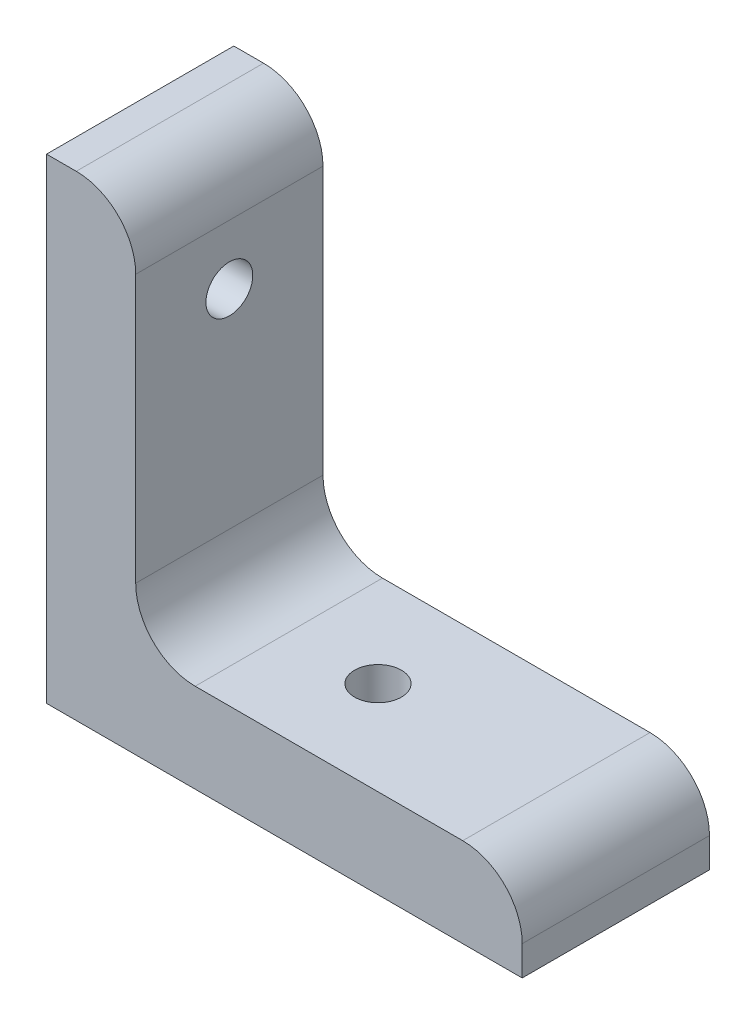
ISO-10303-21;
HEADER;
FILE_DESCRIPTION(('STEP AP214'),'2;1');
FILE_NAME('part.step','',(''),(''),'','','');
FILE_SCHEMA(('AUTOMOTIVE_DESIGN { 1 0 10303 214 1 1 1 1 }'));
ENDSEC;
DATA;
#1=APPLICATION_CONTEXT('core data for automotive mechanical design processes');
#2=APPLICATION_PROTOCOL_DEFINITION('international standard','automotive_design',2000,#1);
#3=PRODUCT_CONTEXT('',#1,'mechanical');
#4=PRODUCT('Part','Part','',(#3));
#5=PRODUCT_RELATED_PRODUCT_CATEGORY('part','',(#4));
#6=PRODUCT_DEFINITION_FORMATION('','',#4);
#7=PRODUCT_DEFINITION_CONTEXT('part definition',#1,'design');
#8=PRODUCT_DEFINITION('design','',#6,#7);
#9=PRODUCT_DEFINITION_SHAPE('','',#8);
#10=(LENGTH_UNIT() NAMED_UNIT(*) SI_UNIT(.MILLI.,.METRE.));
#11=(NAMED_UNIT(*) PLANE_ANGLE_UNIT() SI_UNIT($,.RADIAN.));
#12=(NAMED_UNIT(*) SI_UNIT($,.STERADIAN.) SOLID_ANGLE_UNIT());
#13=UNCERTAINTY_MEASURE_WITH_UNIT(LENGTH_MEASURE(1.E-05),#10,'distance_accuracy_value','');
#14=(GEOMETRIC_REPRESENTATION_CONTEXT(3) GLOBAL_UNCERTAINTY_ASSIGNED_CONTEXT((#13)) GLOBAL_UNIT_ASSIGNED_CONTEXT((#10,
#11,#12)) REPRESENTATION_CONTEXT('',''));
#15=CARTESIAN_POINT('',(0.,0.,0.));
#16=DIRECTION('',(0.,0.,1.));
#17=DIRECTION('',(1.,0.,0.));
#18=AXIS2_PLACEMENT_3D('',#15,#16,#17);
#19=CARTESIAN_POINT('',(50.8,0.,-20.));
#20=DIRECTION('',(0.,-1.,0.));
#21=DIRECTION('',(1.,0.,0.));
#22=AXIS2_PLACEMENT_3D('',#19,#20,#21);
#23=PLANE('',#22);
#24=CARTESIAN_POINT('',(25.4,0.,-10.));
#25=DIRECTION('',(0.,-1.,0.));
#26=DIRECTION('',(0.,0.,-1.));
#27=AXIS2_PLACEMENT_3D('',#24,#25,#26);
#28=CIRCLE('',#27,2.5);
#29=CARTESIAN_POINT('',(25.4,0.,-12.5));
#30=VERTEX_POINT('',#29);
#31=EDGE_CURVE('E315',#30,#30,#28,.T.);
#32=ORIENTED_EDGE('',*,*,#31,.F.);
#33=EDGE_LOOP('',(#32));
#34=FACE_BOUND('',#33,.T.);
#35=DIRECTION('',(1.,0.,0.));
#36=VECTOR('',#35,1.);
#37=CARTESIAN_POINT('',(50.8,0.,0.));
#38=LINE('',#37,#36);
#39=CARTESIAN_POINT('',(0.,0.,0.));
#40=VERTEX_POINT('',#39);
#41=CARTESIAN_POINT('',(50.8,0.,0.));
#42=VERTEX_POINT('',#41);
#43=EDGE_CURVE('E142',#40,#42,#38,.T.);
#44=ORIENTED_EDGE('',*,*,#43,.F.);
#45=DIRECTION('',(0.,0.,1.));
#46=VECTOR('',#45,1.);
#47=CARTESIAN_POINT('',(0.,0.,-20.));
#48=LINE('',#47,#46);
#49=CARTESIAN_POINT('',(0.,0.,-20.));
#50=VERTEX_POINT('',#49);
#51=EDGE_CURVE('E125',#50,#40,#48,.T.);
#52=ORIENTED_EDGE('',*,*,#51,.F.);
#53=DIRECTION('',(1.,0.,0.));
#54=VECTOR('',#53,1.);
#55=CARTESIAN_POINT('',(50.8,0.,-20.));
#56=LINE('',#55,#54);
#57=CARTESIAN_POINT('',(50.8,0.,-20.));
#58=VERTEX_POINT('',#57);
#59=EDGE_CURVE('E121',#50,#58,#56,.T.);
#60=ORIENTED_EDGE('',*,*,#59,.T.);
#61=DIRECTION('',(0.,0.,1.));
#62=VECTOR('',#61,1.);
#63=CARTESIAN_POINT('',(50.8,0.,-20.));
#64=LINE('',#63,#62);
#65=EDGE_CURVE('E103',#58,#42,#64,.T.);
#66=ORIENTED_EDGE('',*,*,#65,.T.);
#67=EDGE_LOOP('',(#44,#52,#60,#66));
#68=FACE_BOUND('',#67,.T.);
#69=ADVANCED_FACE('F33',(#34,#68),#23,.T.);
#70=CARTESIAN_POINT('',(0.,0.,-20.));
#71=DIRECTION('',(-1.,0.,0.));
#72=DIRECTION('',(0.,0.,1.));
#73=AXIS2_PLACEMENT_3D('',#70,#71,#72);
#74=PLANE('',#73);
#75=CARTESIAN_POINT('',(0.,38.1,-10.));
#76=DIRECTION('',(-1.,0.,0.));
#77=DIRECTION('',(0.,0.,1.));
#78=AXIS2_PLACEMENT_3D('',#75,#76,#77);
#79=CIRCLE('',#78,2.49999999999999);
#80=CARTESIAN_POINT('',(0.,38.1,-7.50000000000001));
#81=VERTEX_POINT('',#80);
#82=EDGE_CURVE('E319',#81,#81,#79,.T.);
#83=ORIENTED_EDGE('',*,*,#82,.F.);
#84=EDGE_LOOP('',(#83));
#85=FACE_BOUND('',#84,.T.);
#86=DIRECTION('',(0.,-1.,0.));
#87=VECTOR('',#86,1.);
#88=CARTESIAN_POINT('',(0.,0.,0.));
#89=LINE('',#88,#87);
#90=CARTESIAN_POINT('',(0.,50.8,0.));
#91=VERTEX_POINT('',#90);
#92=EDGE_CURVE('E126',#91,#40,#89,.T.);
#93=ORIENTED_EDGE('',*,*,#92,.F.);
#94=DIRECTION('',(0.,0.,1.));
#95=VECTOR('',#94,1.);
#96=CARTESIAN_POINT('',(0.,50.8,-20.));
#97=LINE('',#96,#95);
#98=CARTESIAN_POINT('',(0.,50.8,-20.));
#99=VERTEX_POINT('',#98);
#100=EDGE_CURVE('E114',#99,#91,#97,.T.);
#101=ORIENTED_EDGE('',*,*,#100,.F.);
#102=DIRECTION('',(0.,-1.,0.));
#103=VECTOR('',#102,1.);
#104=CARTESIAN_POINT('',(0.,0.,-20.));
#105=LINE('',#104,#103);
#106=EDGE_CURVE('E115',#99,#50,#105,.T.);
#107=ORIENTED_EDGE('',*,*,#106,.T.);
#108=ORIENTED_EDGE('',*,*,#51,.T.);
#109=EDGE_LOOP('',(#93,#101,#107,#108));
#110=FACE_BOUND('',#109,.T.);
#111=ADVANCED_FACE('F194',(#85,#110),#74,.T.);
#112=CARTESIAN_POINT('',(0.,50.8,-20.));
#113=DIRECTION('',(0.,1.,0.));
#114=DIRECTION('',(0.,0.,1.));
#115=AXIS2_PLACEMENT_3D('',#112,#113,#114);
#116=PLANE('',#115);
#117=DIRECTION('',(-1.,0.,0.));
#118=VECTOR('',#117,1.);
#119=CARTESIAN_POINT('',(0.,50.8,0.));
#120=LINE('',#119,#118);
#121=CARTESIAN_POINT('',(3.175,50.8,0.));
#122=VERTEX_POINT('',#121);
#123=EDGE_CURVE('E129',#122,#91,#120,.T.);
#124=ORIENTED_EDGE('',*,*,#123,.F.);
#125=DIRECTION('',(0.,0.,1.));
#126=VECTOR('',#125,1.);
#127=CARTESIAN_POINT('',(3.175,50.8,-20.));
#128=LINE('',#127,#126);
#129=CARTESIAN_POINT('',(3.175,50.8,-20.));
#130=VERTEX_POINT('',#129);
#131=EDGE_CURVE('E164',#122,#130,#128,.F.);
#132=ORIENTED_EDGE('',*,*,#131,.T.);
#133=DIRECTION('',(-1.,0.,0.));
#134=VECTOR('',#133,1.);
#135=CARTESIAN_POINT('',(0.,50.8,-20.));
#136=LINE('',#135,#134);
#137=EDGE_CURVE('E139',#130,#99,#136,.T.);
#138=ORIENTED_EDGE('',*,*,#137,.T.);
#139=ORIENTED_EDGE('',*,*,#100,.T.);
#140=EDGE_LOOP('',(#124,#132,#138,#139));
#141=FACE_BOUND('',#140,.T.);
#142=ADVANCED_FACE('F200',(#141),#116,.T.);
#143=CARTESIAN_POINT('',(9.525,50.8,-20.));
#144=DIRECTION('',(1.,0.,0.));
#145=DIRECTION('',(0.,1.,0.));
#146=AXIS2_PLACEMENT_3D('',#143,#144,#145);
#147=PLANE('',#146);
#148=CARTESIAN_POINT('',(9.525,38.1,-10.));
#149=DIRECTION('',(1.,0.,0.));
#150=DIRECTION('',(0.,1.,0.));
#151=AXIS2_PLACEMENT_3D('',#148,#149,#150);
#152=CIRCLE('',#151,2.49999999999999);
#153=CARTESIAN_POINT('',(9.525,40.6,-10.));
#154=VERTEX_POINT('',#153);
#155=EDGE_CURVE('E317',#154,#154,#152,.T.);
#156=ORIENTED_EDGE('',*,*,#155,.F.);
#157=EDGE_LOOP('',(#156));
#158=FACE_BOUND('',#157,.T.);
#159=DIRECTION('',(0.,1.,0.));
#160=VECTOR('',#159,1.);
#161=CARTESIAN_POINT('',(9.525,50.8,-20.));
#162=LINE('',#161,#160);
#163=CARTESIAN_POINT('',(9.525,15.875,-20.));
#164=VERTEX_POINT('',#163);
#165=CARTESIAN_POINT('',(9.525,44.45,-20.));
#166=VERTEX_POINT('',#165);
#167=EDGE_CURVE('E136',#164,#166,#162,.T.);
#168=ORIENTED_EDGE('',*,*,#167,.T.);
#169=DIRECTION('',(0.,0.,1.));
#170=VECTOR('',#169,1.);
#171=CARTESIAN_POINT('',(9.525,44.45,-20.));
#172=LINE('',#171,#170);
#173=CARTESIAN_POINT('',(9.525,44.45,0.));
#174=VERTEX_POINT('',#173);
#175=EDGE_CURVE('E157',#166,#174,#172,.T.);
#176=ORIENTED_EDGE('',*,*,#175,.T.);
#177=DIRECTION('',(0.,1.,0.));
#178=VECTOR('',#177,1.);
#179=CARTESIAN_POINT('',(9.525,50.8,0.));
#180=LINE('',#179,#178);
#181=CARTESIAN_POINT('',(9.525,15.875,0.));
#182=VERTEX_POINT('',#181);
#183=EDGE_CURVE('E148',#182,#174,#180,.T.);
#184=ORIENTED_EDGE('',*,*,#183,.F.);
#185=DIRECTION('',(0.,0.,1.));
#186=VECTOR('',#185,1.);
#187=CARTESIAN_POINT('',(9.525,15.875,-20.));
#188=LINE('',#187,#186);
#189=EDGE_CURVE('E153',#182,#164,#188,.F.);
#190=ORIENTED_EDGE('',*,*,#189,.T.);
#191=EDGE_LOOP('',(#168,#176,#184,#190));
#192=FACE_BOUND('',#191,.T.);
#193=ADVANCED_FACE('F183',(#158,#192),#147,.T.);
#194=CARTESIAN_POINT('',(9.525,9.525,-20.));
#195=DIRECTION('',(0.,1.,0.));
#196=DIRECTION('',(-1.,0.,0.));
#197=AXIS2_PLACEMENT_3D('',#194,#195,#196);
#198=PLANE('',#197);
#199=CARTESIAN_POINT('',(25.4,9.525,-10.));
#200=DIRECTION('',(0.,1.,0.));
#201=DIRECTION('',(-1.,0.,0.));
#202=AXIS2_PLACEMENT_3D('',#199,#200,#201);
#203=CIRCLE('',#202,2.49999999999999);
#204=CARTESIAN_POINT('',(22.9,9.525,-10.));
#205=VERTEX_POINT('',#204);
#206=EDGE_CURVE('E132',#205,#205,#203,.T.);
#207=ORIENTED_EDGE('',*,*,#206,.F.);
#208=EDGE_LOOP('',(#207));
#209=FACE_BOUND('',#208,.T.);
#210=DIRECTION('',(-1.,0.,0.));
#211=VECTOR('',#210,1.);
#212=CARTESIAN_POINT('',(9.525,9.525,0.));
#213=LINE('',#212,#211);
#214=CARTESIAN_POINT('',(44.45,9.525,0.));
#215=VERTEX_POINT('',#214);
#216=CARTESIAN_POINT('',(15.875,9.525,0.));
#217=VERTEX_POINT('',#216);
#218=EDGE_CURVE('E145',#215,#217,#213,.T.);
#219=ORIENTED_EDGE('',*,*,#218,.F.);
#220=DIRECTION('',(0.,0.,1.));
#221=VECTOR('',#220,1.);
#222=CARTESIAN_POINT('',(44.45,9.525,-20.));
#223=LINE('',#222,#221);
#224=CARTESIAN_POINT('',(44.45,9.525,-20.));
#225=VERTEX_POINT('',#224);
#226=EDGE_CURVE('E174',#215,#225,#223,.F.);
#227=ORIENTED_EDGE('',*,*,#226,.T.);
#228=DIRECTION('',(-1.,0.,0.));
#229=VECTOR('',#228,1.);
#230=CARTESIAN_POINT('',(9.525,9.525,-20.));
#231=LINE('',#230,#229);
#232=CARTESIAN_POINT('',(15.875,9.525,-20.));
#233=VERTEX_POINT('',#232);
#234=EDGE_CURVE('E123',#225,#233,#231,.T.);
#235=ORIENTED_EDGE('',*,*,#234,.T.);
#236=DIRECTION('',(0.,0.,1.));
#237=VECTOR('',#236,1.);
#238=CARTESIAN_POINT('',(15.875,9.525,0.));
#239=LINE('',#238,#237);
#240=EDGE_CURVE('E171',#233,#217,#239,.T.);
#241=ORIENTED_EDGE('',*,*,#240,.T.);
#242=EDGE_LOOP('',(#219,#227,#235,#241));
#243=FACE_BOUND('',#242,.T.);
#244=ADVANCED_FACE('F186',(#209,#243),#198,.T.);
#245=CARTESIAN_POINT('',(50.8,9.525,-20.));
#246=DIRECTION('',(1.,0.,0.));
#247=DIRECTION('',(0.,0.,-1.));
#248=AXIS2_PLACEMENT_3D('',#245,#246,#247);
#249=PLANE('',#248);
#250=DIRECTION('',(0.,1.,0.));
#251=VECTOR('',#250,1.);
#252=CARTESIAN_POINT('',(50.8,9.525,-20.));
#253=LINE('',#252,#251);
#254=CARTESIAN_POINT('',(50.8,3.175,-20.));
#255=VERTEX_POINT('',#254);
#256=EDGE_CURVE('E106',#58,#255,#253,.T.);
#257=ORIENTED_EDGE('',*,*,#256,.T.);
#258=DIRECTION('',(0.,0.,1.));
#259=VECTOR('',#258,1.);
#260=CARTESIAN_POINT('',(50.8,3.175,-20.));
#261=LINE('',#260,#259);
#262=CARTESIAN_POINT('',(50.8,3.175,0.));
#263=VERTEX_POINT('',#262);
#264=EDGE_CURVE('E169',#255,#263,#261,.T.);
#265=ORIENTED_EDGE('',*,*,#264,.T.);
#266=DIRECTION('',(0.,1.,0.));
#267=VECTOR('',#266,1.);
#268=CARTESIAN_POINT('',(50.8,9.525,0.));
#269=LINE('',#268,#267);
#270=EDGE_CURVE('E109',#42,#263,#269,.T.);
#271=ORIENTED_EDGE('',*,*,#270,.F.);
#272=ORIENTED_EDGE('',*,*,#65,.F.);
#273=EDGE_LOOP('',(#257,#265,#271,#272));
#274=FACE_BOUND('',#273,.T.);
#275=ADVANCED_FACE('F104',(#274),#249,.T.);
#276=CARTESIAN_POINT('',(0.,0.,-20.));
#277=DIRECTION('',(0.,0.,-1.));
#278=DIRECTION('',(-1.,0.,0.));
#279=AXIS2_PLACEMENT_3D('',#276,#277,#278);
#280=PLANE('',#279);
#281=ORIENTED_EDGE('',*,*,#137,.F.);
#282=CARTESIAN_POINT('',(3.175,44.45,-20.));
#283=DIRECTION('',(0.,0.,-1.));
#284=DIRECTION('',(-1.,0.,0.));
#285=AXIS2_PLACEMENT_3D('',#282,#283,#284);
#286=CIRCLE('',#285,6.35);
#287=EDGE_CURVE('E167',#130,#166,#286,.T.);
#288=ORIENTED_EDGE('',*,*,#287,.T.);
#289=ORIENTED_EDGE('',*,*,#167,.F.);
#290=CARTESIAN_POINT('',(15.875,15.875,-20.));
#291=DIRECTION('',(0.,0.,-1.));
#292=DIRECTION('',(-1.,0.,0.));
#293=AXIS2_PLACEMENT_3D('',#290,#291,#292);
#294=CIRCLE('',#293,6.35);
#295=EDGE_CURVE('E11',#164,#233,#294,.F.);
#296=ORIENTED_EDGE('',*,*,#295,.T.);
#297=ORIENTED_EDGE('',*,*,#234,.F.);
#298=CARTESIAN_POINT('',(44.45,3.175,-20.));
#299=DIRECTION('',(0.,0.,-1.));
#300=DIRECTION('',(-1.,0.,0.));
#301=AXIS2_PLACEMENT_3D('',#298,#299,#300);
#302=CIRCLE('',#301,6.35);
#303=EDGE_CURVE('E48',#225,#255,#302,.T.);
#304=ORIENTED_EDGE('',*,*,#303,.T.);
#305=ORIENTED_EDGE('',*,*,#256,.F.);
#306=ORIENTED_EDGE('',*,*,#59,.F.);
#307=ORIENTED_EDGE('',*,*,#106,.F.);
#308=EDGE_LOOP('',(#281,#288,#289,#296,#297,#304,#305,#306,#307));
#309=FACE_BOUND('',#308,.T.);
#310=ADVANCED_FACE('F119',(#309),#280,.T.);
#311=CARTESIAN_POINT('',(0.,0.,0.));
#312=DIRECTION('',(0.,0.,-1.));
#313=DIRECTION('',(-1.,0.,0.));
#314=AXIS2_PLACEMENT_3D('',#311,#312,#313);
#315=PLANE('',#314);
#316=ORIENTED_EDGE('',*,*,#183,.T.);
#317=CARTESIAN_POINT('',(3.175,44.45,0.));
#318=DIRECTION('',(0.,0.,-1.));
#319=DIRECTION('',(-1.,0.,0.));
#320=AXIS2_PLACEMENT_3D('',#317,#318,#319);
#321=CIRCLE('',#320,6.35);
#322=EDGE_CURVE('E162',#174,#122,#321,.F.);
#323=ORIENTED_EDGE('',*,*,#322,.T.);
#324=ORIENTED_EDGE('',*,*,#123,.T.);
#325=ORIENTED_EDGE('',*,*,#92,.T.);
#326=ORIENTED_EDGE('',*,*,#43,.T.);
#327=ORIENTED_EDGE('',*,*,#270,.T.);
#328=CARTESIAN_POINT('',(44.45,3.175,0.));
#329=DIRECTION('',(0.,0.,-1.));
#330=DIRECTION('',(-1.,0.,0.));
#331=AXIS2_PLACEMENT_3D('',#328,#329,#330);
#332=CIRCLE('',#331,6.35);
#333=EDGE_CURVE('E160',#263,#215,#332,.F.);
#334=ORIENTED_EDGE('',*,*,#333,.T.);
#335=ORIENTED_EDGE('',*,*,#218,.T.);
#336=CARTESIAN_POINT('',(15.875,15.875,0.));
#337=DIRECTION('',(0.,0.,-1.));
#338=DIRECTION('',(-1.,0.,0.));
#339=AXIS2_PLACEMENT_3D('',#336,#337,#338);
#340=CIRCLE('',#339,6.35);
#341=EDGE_CURVE('E41',#217,#182,#340,.T.);
#342=ORIENTED_EDGE('',*,*,#341,.T.);
#343=EDGE_LOOP('',(#316,#323,#324,#325,#326,#327,#334,#335,#342));
#344=FACE_BOUND('',#343,.T.);
#345=ADVANCED_FACE('F177',(#344),#315,.F.);
#346=CARTESIAN_POINT('',(3.175,44.45,-20.));
#347=DIRECTION('',(0.,0.,1.));
#348=DIRECTION('',(1.,0.,0.));
#349=AXIS2_PLACEMENT_3D('',#346,#347,#348);
#350=CYLINDRICAL_SURFACE('',#349,6.35);
#351=ORIENTED_EDGE('',*,*,#287,.F.);
#352=ORIENTED_EDGE('',*,*,#131,.F.);
#353=ORIENTED_EDGE('',*,*,#322,.F.);
#354=ORIENTED_EDGE('',*,*,#175,.F.);
#355=EDGE_LOOP('',(#351,#352,#353,#354));
#356=FACE_BOUND('',#355,.T.);
#357=ADVANCED_FACE('F199',(#356),#350,.T.);
#358=CARTESIAN_POINT('',(44.45,3.175,-20.));
#359=DIRECTION('',(0.,0.,1.));
#360=DIRECTION('',(1.,0.,0.));
#361=AXIS2_PLACEMENT_3D('',#358,#359,#360);
#362=CYLINDRICAL_SURFACE('',#361,6.35);
#363=ORIENTED_EDGE('',*,*,#303,.F.);
#364=ORIENTED_EDGE('',*,*,#226,.F.);
#365=ORIENTED_EDGE('',*,*,#333,.F.);
#366=ORIENTED_EDGE('',*,*,#264,.F.);
#367=EDGE_LOOP('',(#363,#364,#365,#366));
#368=FACE_BOUND('',#367,.T.);
#369=ADVANCED_FACE('F189',(#368),#362,.T.);
#370=CARTESIAN_POINT('',(15.875,15.875,-20.));
#371=DIRECTION('',(0.,0.,-1.));
#372=DIRECTION('',(-1.,0.,0.));
#373=AXIS2_PLACEMENT_3D('',#370,#371,#372);
#374=CYLINDRICAL_SURFACE('',#373,6.35);
#375=ORIENTED_EDGE('',*,*,#295,.F.);
#376=ORIENTED_EDGE('',*,*,#189,.F.);
#377=ORIENTED_EDGE('',*,*,#341,.F.);
#378=ORIENTED_EDGE('',*,*,#240,.F.);
#379=EDGE_LOOP('',(#375,#376,#377,#378));
#380=FACE_BOUND('',#379,.T.);
#381=ADVANCED_FACE('F35',(#380),#374,.F.);
#382=CARTESIAN_POINT('',(25.4,0.,-10.));
#383=DIRECTION('',(0.,-1.,0.));
#384=DIRECTION('',(0.,0.,-1.));
#385=AXIS2_PLACEMENT_3D('',#382,#383,#384);
#386=CYLINDRICAL_SURFACE('',#385,2.49999999999999);
#387=ORIENTED_EDGE('',*,*,#206,.T.);
#388=EDGE_LOOP('',(#387));
#389=FACE_BOUND('',#388,.T.);
#390=ORIENTED_EDGE('',*,*,#31,.T.);
#391=EDGE_LOOP('',(#390));
#392=FACE_BOUND('',#391,.T.);
#393=ADVANCED_FACE('F227',(#389,#392),#386,.F.);
#394=CARTESIAN_POINT('',(0.,38.1,-10.));
#395=DIRECTION('',(-1.,0.,0.));
#396=DIRECTION('',(0.,0.,1.));
#397=AXIS2_PLACEMENT_3D('',#394,#395,#396);
#398=CYLINDRICAL_SURFACE('',#397,2.49999999999999);
#399=ORIENTED_EDGE('',*,*,#155,.T.);
#400=EDGE_LOOP('',(#399));
#401=FACE_BOUND('',#400,.T.);
#402=ORIENTED_EDGE('',*,*,#82,.T.);
#403=EDGE_LOOP('',(#402));
#404=FACE_BOUND('',#403,.T.);
#405=ADVANCED_FACE('F231',(#401,#404),#398,.F.);
#406=CLOSED_SHELL('',(#69,#111,#142,#193,#244,#275,#310,#345,#357,#369,#381,#393,#405));
#407=MANIFOLD_SOLID_BREP('B2',#406);
#408=ADVANCED_BREP_SHAPE_REPRESENTATION('',(#18,#407),#14);
#409=SHAPE_DEFINITION_REPRESENTATION(#9,#408);
ENDSEC;
END-ISO-10303-21;
